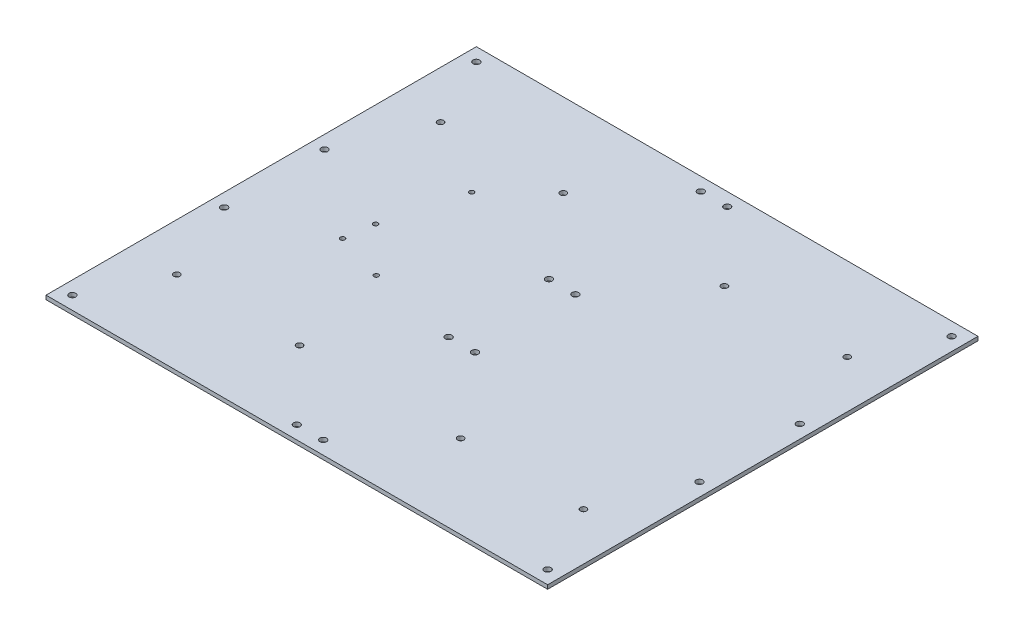
ISO-10303-21;
HEADER;
FILE_DESCRIPTION(('STEP AP214'),'2;1');
FILE_NAME('part.step','',(''),(''),'','','');
FILE_SCHEMA(('AUTOMOTIVE_DESIGN { 1 0 10303 214 1 1 1 1 }'));
ENDSEC;
DATA;
#1=APPLICATION_CONTEXT('core data for automotive mechanical design processes');
#2=APPLICATION_PROTOCOL_DEFINITION('international standard','automotive_design',2000,#1);
#3=PRODUCT_CONTEXT('',#1,'mechanical');
#4=PRODUCT('Part','Part','',(#3));
#5=PRODUCT_RELATED_PRODUCT_CATEGORY('part','',(#4));
#6=PRODUCT_DEFINITION_FORMATION('','',#4);
#7=PRODUCT_DEFINITION_CONTEXT('part definition',#1,'design');
#8=PRODUCT_DEFINITION('design','',#6,#7);
#9=PRODUCT_DEFINITION_SHAPE('','',#8);
#10=(LENGTH_UNIT() NAMED_UNIT(*) SI_UNIT(.MILLI.,.METRE.));
#11=(NAMED_UNIT(*) PLANE_ANGLE_UNIT() SI_UNIT($,.RADIAN.));
#12=(NAMED_UNIT(*) SI_UNIT($,.STERADIAN.) SOLID_ANGLE_UNIT());
#13=UNCERTAINTY_MEASURE_WITH_UNIT(LENGTH_MEASURE(1.E-05),#10,'distance_accuracy_value','');
#14=(GEOMETRIC_REPRESENTATION_CONTEXT(3) GLOBAL_UNCERTAINTY_ASSIGNED_CONTEXT((#13)) GLOBAL_UNIT_ASSIGNED_CONTEXT((#10,
#11,#12)) REPRESENTATION_CONTEXT('',''));
#15=CARTESIAN_POINT('',(0.,0.,0.));
#16=DIRECTION('',(0.,0.,1.));
#17=DIRECTION('',(1.,0.,0.));
#18=AXIS2_PLACEMENT_3D('',#15,#16,#17);
#19=CARTESIAN_POINT('',(-190.,3.,163.));
#20=DIRECTION('',(1.,0.,0.));
#21=DIRECTION('',(0.,0.,-1.));
#22=AXIS2_PLACEMENT_3D('',#19,#20,#21);
#23=PLANE('',#22);
#24=DIRECTION('',(0.,0.,1.));
#25=VECTOR('',#24,1.);
#26=CARTESIAN_POINT('',(-190.,0.,163.));
#27=LINE('',#26,#25);
#28=CARTESIAN_POINT('',(-190.,0.,-163.));
#29=VERTEX_POINT('',#28);
#30=CARTESIAN_POINT('',(-190.,0.,163.));
#31=VERTEX_POINT('',#30);
#32=EDGE_CURVE('E108',#29,#31,#27,.T.);
#33=ORIENTED_EDGE('',*,*,#32,.T.);
#34=DIRECTION('',(0.,-1.,0.));
#35=VECTOR('',#34,1.);
#36=CARTESIAN_POINT('',(-190.,3.,163.));
#37=LINE('',#36,#35);
#38=CARTESIAN_POINT('',(-190.,3.,163.));
#39=VERTEX_POINT('',#38);
#40=EDGE_CURVE('E11',#39,#31,#37,.T.);
#41=ORIENTED_EDGE('',*,*,#40,.F.);
#42=DIRECTION('',(0.,0.,1.));
#43=VECTOR('',#42,1.);
#44=CARTESIAN_POINT('',(-190.,3.,163.));
#45=LINE('',#44,#43);
#46=CARTESIAN_POINT('',(-190.,3.,-163.));
#47=VERTEX_POINT('',#46);
#48=EDGE_CURVE('E96',#47,#39,#45,.T.);
#49=ORIENTED_EDGE('',*,*,#48,.F.);
#50=DIRECTION('',(0.,-1.,0.));
#51=VECTOR('',#50,1.);
#52=CARTESIAN_POINT('',(-190.,3.,-163.));
#53=LINE('',#52,#51);
#54=EDGE_CURVE('E104',#47,#29,#53,.T.);
#55=ORIENTED_EDGE('',*,*,#54,.T.);
#56=EDGE_LOOP('',(#33,#41,#49,#55));
#57=FACE_BOUND('',#56,.T.);
#58=ADVANCED_FACE('F45',(#57),#23,.F.);
#59=CARTESIAN_POINT('',(190.,3.,163.));
#60=DIRECTION('',(0.,0.,-1.));
#61=DIRECTION('',(-1.,0.,0.));
#62=AXIS2_PLACEMENT_3D('',#59,#60,#61);
#63=PLANE('',#62);
#64=DIRECTION('',(1.,0.,0.));
#65=VECTOR('',#64,1.);
#66=CARTESIAN_POINT('',(190.,0.,163.));
#67=LINE('',#66,#65);
#68=CARTESIAN_POINT('',(190.,0.,163.));
#69=VERTEX_POINT('',#68);
#70=EDGE_CURVE('E100',#31,#69,#67,.T.);
#71=ORIENTED_EDGE('',*,*,#70,.T.);
#72=DIRECTION('',(0.,-1.,0.));
#73=VECTOR('',#72,1.);
#74=CARTESIAN_POINT('',(190.,3.,163.));
#75=LINE('',#74,#73);
#76=CARTESIAN_POINT('',(190.,3.,163.));
#77=VERTEX_POINT('',#76);
#78=EDGE_CURVE('E53',#77,#69,#75,.T.);
#79=ORIENTED_EDGE('',*,*,#78,.F.);
#80=DIRECTION('',(1.,0.,0.));
#81=VECTOR('',#80,1.);
#82=CARTESIAN_POINT('',(190.,3.,163.));
#83=LINE('',#82,#81);
#84=EDGE_CURVE('E91',#39,#77,#83,.T.);
#85=ORIENTED_EDGE('',*,*,#84,.F.);
#86=ORIENTED_EDGE('',*,*,#40,.T.);
#87=EDGE_LOOP('',(#71,#79,#85,#86));
#88=FACE_BOUND('',#87,.T.);
#89=ADVANCED_FACE('F99',(#88),#63,.F.);
#90=CARTESIAN_POINT('',(190.,3.,163.));
#91=DIRECTION('',(-1.,0.,0.));
#92=DIRECTION('',(0.,0.,1.));
#93=AXIS2_PLACEMENT_3D('',#90,#91,#92);
#94=PLANE('',#93);
#95=DIRECTION('',(0.,0.,-1.));
#96=VECTOR('',#95,1.);
#97=CARTESIAN_POINT('',(190.,0.,163.));
#98=LINE('',#97,#96);
#99=CARTESIAN_POINT('',(190.,0.,-163.));
#100=VERTEX_POINT('',#99);
#101=EDGE_CURVE('E78',#69,#100,#98,.T.);
#102=ORIENTED_EDGE('',*,*,#101,.T.);
#103=DIRECTION('',(0.,-1.,0.));
#104=VECTOR('',#103,1.);
#105=CARTESIAN_POINT('',(190.,3.,-163.));
#106=LINE('',#105,#104);
#107=CARTESIAN_POINT('',(190.,3.,-163.));
#108=VERTEX_POINT('',#107);
#109=EDGE_CURVE('E101',#108,#100,#106,.T.);
#110=ORIENTED_EDGE('',*,*,#109,.F.);
#111=DIRECTION('',(0.,0.,-1.));
#112=VECTOR('',#111,1.);
#113=CARTESIAN_POINT('',(190.,3.,163.));
#114=LINE('',#113,#112);
#115=EDGE_CURVE('E94',#77,#108,#114,.T.);
#116=ORIENTED_EDGE('',*,*,#115,.F.);
#117=ORIENTED_EDGE('',*,*,#78,.T.);
#118=EDGE_LOOP('',(#102,#110,#116,#117));
#119=FACE_BOUND('',#118,.T.);
#120=ADVANCED_FACE('F102',(#119),#94,.F.);
#121=CARTESIAN_POINT('',(190.,3.,-163.));
#122=DIRECTION('',(0.,0.,1.));
#123=DIRECTION('',(1.,0.,0.));
#124=AXIS2_PLACEMENT_3D('',#121,#122,#123);
#125=PLANE('',#124);
#126=DIRECTION('',(-1.,0.,0.));
#127=VECTOR('',#126,1.);
#128=CARTESIAN_POINT('',(190.,0.,-163.));
#129=LINE('',#128,#127);
#130=EDGE_CURVE('E84',#100,#29,#129,.T.);
#131=ORIENTED_EDGE('',*,*,#130,.T.);
#132=ORIENTED_EDGE('',*,*,#54,.F.);
#133=DIRECTION('',(-1.,0.,0.));
#134=VECTOR('',#133,1.);
#135=CARTESIAN_POINT('',(190.,3.,-163.));
#136=LINE('',#135,#134);
#137=EDGE_CURVE('E61',#108,#47,#136,.T.);
#138=ORIENTED_EDGE('',*,*,#137,.F.);
#139=ORIENTED_EDGE('',*,*,#109,.T.);
#140=EDGE_LOOP('',(#131,#132,#138,#139));
#141=FACE_BOUND('',#140,.T.);
#142=ADVANCED_FACE('F116',(#141),#125,.F.);
#143=CARTESIAN_POINT('',(0.,3.,0.));
#144=DIRECTION('',(0.,1.,0.));
#145=DIRECTION('',(0.,0.,1.));
#146=AXIS2_PLACEMENT_3D('',#143,#144,#145);
#147=PLANE('',#146);
#148=CARTESIAN_POINT('',(-96.3390472553626,3.,-65.75));
#149=DIRECTION('',(0.,1.,0.));
#150=DIRECTION('',(0.,0.,1.));
#151=AXIS2_PLACEMENT_3D('',#148,#149,#150);
#152=CIRCLE('',#151,1.75);
#153=CARTESIAN_POINT('',(-96.3390472553626,3.,-64.));
#154=VERTEX_POINT('',#153);
#155=EDGE_CURVE('E275',#154,#154,#152,.T.);
#156=ORIENTED_EDGE('',*,*,#155,.F.);
#157=EDGE_LOOP('',(#156));
#158=FACE_BOUND('',#157,.T.);
#159=CARTESIAN_POINT('',(-111.839047255363,3.,-8.50000000000004));
#160=DIRECTION('',(0.,1.,0.));
#161=DIRECTION('',(0.,0.,1.));
#162=AXIS2_PLACEMENT_3D('',#159,#160,#161);
#163=CIRCLE('',#162,1.75);
#164=CARTESIAN_POINT('',(-111.839047255363,3.,-6.75000000000004));
#165=VERTEX_POINT('',#164);
#166=EDGE_CURVE('E281',#165,#165,#163,.T.);
#167=ORIENTED_EDGE('',*,*,#166,.F.);
#168=EDGE_LOOP('',(#167));
#169=FACE_BOUND('',#168,.T.);
#170=CARTESIAN_POINT('',(-77.8390472553626,3.,25.));
#171=DIRECTION('',(0.,1.,0.));
#172=DIRECTION('',(0.,0.,1.));
#173=AXIS2_PLACEMENT_3D('',#170,#171,#172);
#174=CIRCLE('',#173,1.75);
#175=CARTESIAN_POINT('',(-77.8390472553626,3.,26.75));
#176=VERTEX_POINT('',#175);
#177=EDGE_CURVE('E269',#176,#176,#174,.T.);
#178=ORIENTED_EDGE('',*,*,#177,.F.);
#179=EDGE_LOOP('',(#178));
#180=FACE_BOUND('',#179,.T.);
#181=CARTESIAN_POINT('',(-114.839047255363,3.,13.5));
#182=DIRECTION('',(0.,1.,0.));
#183=DIRECTION('',(0.,0.,1.));
#184=AXIS2_PLACEMENT_3D('',#181,#182,#183);
#185=CIRCLE('',#184,1.75);
#186=CARTESIAN_POINT('',(-114.839047255363,3.,15.25));
#187=VERTEX_POINT('',#186);
#188=EDGE_CURVE('E266',#187,#187,#185,.T.);
#189=ORIENTED_EDGE('',*,*,#188,.F.);
#190=EDGE_LOOP('',(#189));
#191=FACE_BOUND('',#190,.T.);
#192=CARTESIAN_POINT('',(-61.,3.,-99.9000000000001));
#193=DIRECTION('',(0.,1.,0.));
#194=DIRECTION('',(0.,0.,1.));
#195=AXIS2_PLACEMENT_3D('',#192,#193,#194);
#196=CIRCLE('',#195,2.35);
#197=CARTESIAN_POINT('',(-61.,3.,-97.5500000000001));
#198=VERTEX_POINT('',#197);
#199=EDGE_CURVE('E239',#198,#198,#196,.T.);
#200=ORIENTED_EDGE('',*,*,#199,.F.);
#201=EDGE_LOOP('',(#200));
#202=FACE_BOUND('',#201,.T.);
#203=CARTESIAN_POINT('',(154.,3.,99.9));
#204=DIRECTION('',(0.,1.,0.));
#205=DIRECTION('',(0.,0.,1.));
#206=AXIS2_PLACEMENT_3D('',#203,#204,#205);
#207=CIRCLE('',#206,2.35);
#208=CARTESIAN_POINT('',(154.,3.,102.25));
#209=VERTEX_POINT('',#208);
#210=EDGE_CURVE('E228',#209,#209,#207,.T.);
#211=ORIENTED_EDGE('',*,*,#210,.F.);
#212=EDGE_LOOP('',(#211));
#213=FACE_BOUND('',#212,.T.);
#214=CARTESIAN_POINT('',(61.0000000000001,3.,99.9));
#215=DIRECTION('',(0.,1.,0.));
#216=DIRECTION('',(0.,0.,1.));
#217=AXIS2_PLACEMENT_3D('',#214,#215,#216);
#218=CIRCLE('',#217,2.35);
#219=CARTESIAN_POINT('',(61.0000000000001,3.,102.25));
#220=VERTEX_POINT('',#219);
#221=EDGE_CURVE('E227',#220,#220,#218,.T.);
#222=ORIENTED_EDGE('',*,*,#221,.F.);
#223=EDGE_LOOP('',(#222));
#224=FACE_BOUND('',#223,.T.);
#225=CARTESIAN_POINT('',(-60.9999999999999,3.,99.9));
#226=DIRECTION('',(0.,1.,0.));
#227=DIRECTION('',(0.,0.,1.));
#228=AXIS2_PLACEMENT_3D('',#225,#226,#227);
#229=CIRCLE('',#228,2.35);
#230=CARTESIAN_POINT('',(-60.9999999999999,3.,102.25));
#231=VERTEX_POINT('',#230);
#232=EDGE_CURVE('E221',#231,#231,#229,.T.);
#233=ORIENTED_EDGE('',*,*,#232,.F.);
#234=EDGE_LOOP('',(#233));
#235=FACE_BOUND('',#234,.T.);
#236=CARTESIAN_POINT('',(61.,3.,-99.9000000000001));
#237=DIRECTION('',(0.,1.,0.));
#238=DIRECTION('',(0.,0.,1.));
#239=AXIS2_PLACEMENT_3D('',#236,#237,#238);
#240=CIRCLE('',#239,2.35);
#241=CARTESIAN_POINT('',(61.,3.,-97.5500000000001));
#242=VERTEX_POINT('',#241);
#243=EDGE_CURVE('E240',#242,#242,#240,.T.);
#244=ORIENTED_EDGE('',*,*,#243,.F.);
#245=EDGE_LOOP('',(#244));
#246=FACE_BOUND('',#245,.T.);
#247=CARTESIAN_POINT('',(154.,3.,-99.9000000000001));
#248=DIRECTION('',(0.,1.,0.));
#249=DIRECTION('',(0.,0.,1.));
#250=AXIS2_PLACEMENT_3D('',#247,#248,#249);
#251=CIRCLE('',#250,2.35);
#252=CARTESIAN_POINT('',(154.,3.,-97.5500000000001));
#253=VERTEX_POINT('',#252);
#254=EDGE_CURVE('E258',#253,#253,#251,.T.);
#255=ORIENTED_EDGE('',*,*,#254,.F.);
#256=EDGE_LOOP('',(#255));
#257=FACE_BOUND('',#256,.T.);
#258=CARTESIAN_POINT('',(-154.,3.,-99.9000000000001));
#259=DIRECTION('',(0.,1.,0.));
#260=DIRECTION('',(0.,0.,1.));
#261=AXIS2_PLACEMENT_3D('',#258,#259,#260);
#262=CIRCLE('',#261,2.35);
#263=CARTESIAN_POINT('',(-154.,3.,-97.5500000000001));
#264=VERTEX_POINT('',#263);
#265=EDGE_CURVE('E251',#264,#264,#262,.T.);
#266=ORIENTED_EDGE('',*,*,#265,.F.);
#267=EDGE_LOOP('',(#266));
#268=FACE_BOUND('',#267,.T.);
#269=CARTESIAN_POINT('',(-154.,3.,99.9));
#270=DIRECTION('',(0.,1.,0.));
#271=DIRECTION('',(0.,0.,1.));
#272=AXIS2_PLACEMENT_3D('',#269,#270,#271);
#273=CIRCLE('',#272,2.35);
#274=CARTESIAN_POINT('',(-154.,3.,102.25));
#275=VERTEX_POINT('',#274);
#276=EDGE_CURVE('E218',#275,#275,#273,.T.);
#277=ORIENTED_EDGE('',*,*,#276,.F.);
#278=EDGE_LOOP('',(#277));
#279=FACE_BOUND('',#278,.T.);
#280=CARTESIAN_POINT('',(10.,3.,-153.));
#281=DIRECTION('',(0.,1.,0.));
#282=DIRECTION('',(0.,0.,1.));
#283=AXIS2_PLACEMENT_3D('',#280,#281,#282);
#284=CIRCLE('',#283,2.5);
#285=CARTESIAN_POINT('',(10.,3.,-150.5));
#286=VERTEX_POINT('',#285);
#287=EDGE_CURVE('E144',#286,#286,#284,.T.);
#288=ORIENTED_EDGE('',*,*,#287,.F.);
#289=EDGE_LOOP('',(#288));
#290=FACE_BOUND('',#289,.T.);
#291=CARTESIAN_POINT('',(-9.99999999999993,3.,-38.));
#292=DIRECTION('',(0.,1.,0.));
#293=DIRECTION('',(0.,0.,1.));
#294=AXIS2_PLACEMENT_3D('',#291,#292,#293);
#295=CIRCLE('',#294,2.50000000000001);
#296=CARTESIAN_POINT('',(-9.99999999999993,3.,-35.5));
#297=VERTEX_POINT('',#296);
#298=EDGE_CURVE('E155',#297,#297,#295,.T.);
#299=ORIENTED_EDGE('',*,*,#298,.F.);
#300=EDGE_LOOP('',(#299));
#301=FACE_BOUND('',#300,.T.);
#302=CARTESIAN_POINT('',(10.,3.,-38.));
#303=DIRECTION('',(0.,1.,0.));
#304=DIRECTION('',(0.,0.,1.));
#305=AXIS2_PLACEMENT_3D('',#302,#303,#304);
#306=CIRCLE('',#305,2.5);
#307=CARTESIAN_POINT('',(10.,3.,-35.5));
#308=VERTEX_POINT('',#307);
#309=EDGE_CURVE('E156',#308,#308,#306,.T.);
#310=ORIENTED_EDGE('',*,*,#309,.F.);
#311=EDGE_LOOP('',(#310));
#312=FACE_BOUND('',#311,.T.);
#313=CARTESIAN_POINT('',(-9.99999999999993,3.,38.));
#314=DIRECTION('',(0.,1.,0.));
#315=DIRECTION('',(0.,0.,1.));
#316=AXIS2_PLACEMENT_3D('',#313,#314,#315);
#317=CIRCLE('',#316,2.5);
#318=CARTESIAN_POINT('',(-9.99999999999993,3.,40.5));
#319=VERTEX_POINT('',#318);
#320=EDGE_CURVE('E167',#319,#319,#317,.T.);
#321=ORIENTED_EDGE('',*,*,#320,.F.);
#322=EDGE_LOOP('',(#321));
#323=FACE_BOUND('',#322,.T.);
#324=CARTESIAN_POINT('',(180.,3.,-153.));
#325=DIRECTION('',(0.,1.,0.));
#326=DIRECTION('',(0.,0.,1.));
#327=AXIS2_PLACEMENT_3D('',#324,#325,#326);
#328=CIRCLE('',#327,2.5);
#329=CARTESIAN_POINT('',(180.,3.,-150.5));
#330=VERTEX_POINT('',#329);
#331=EDGE_CURVE('E125',#330,#330,#328,.T.);
#332=ORIENTED_EDGE('',*,*,#331,.F.);
#333=EDGE_LOOP('',(#332));
#334=FACE_BOUND('',#333,.T.);
#335=CARTESIAN_POINT('',(-180.,3.,153.));
#336=DIRECTION('',(0.,1.,0.));
#337=DIRECTION('',(0.,0.,1.));
#338=AXIS2_PLACEMENT_3D('',#335,#336,#337);
#339=CIRCLE('',#338,2.5);
#340=CARTESIAN_POINT('',(-180.,3.,155.5));
#341=VERTEX_POINT('',#340);
#342=EDGE_CURVE('E131',#341,#341,#339,.T.);
#343=ORIENTED_EDGE('',*,*,#342,.F.);
#344=EDGE_LOOP('',(#343));
#345=FACE_BOUND('',#344,.T.);
#346=CARTESIAN_POINT('',(180.,3.,153.));
#347=DIRECTION('',(0.,1.,0.));
#348=DIRECTION('',(0.,0.,1.));
#349=AXIS2_PLACEMENT_3D('',#346,#347,#348);
#350=CIRCLE('',#349,2.5);
#351=CARTESIAN_POINT('',(180.,3.,155.5));
#352=VERTEX_POINT('',#351);
#353=EDGE_CURVE('E132',#352,#352,#350,.T.);
#354=ORIENTED_EDGE('',*,*,#353,.F.);
#355=EDGE_LOOP('',(#354));
#356=FACE_BOUND('',#355,.T.);
#357=CARTESIAN_POINT('',(-9.99999999999995,3.,-153.));
#358=DIRECTION('',(0.,1.,0.));
#359=DIRECTION('',(0.,0.,1.));
#360=AXIS2_PLACEMENT_3D('',#357,#358,#359);
#361=CIRCLE('',#360,2.5);
#362=CARTESIAN_POINT('',(-9.99999999999995,3.,-150.5));
#363=VERTEX_POINT('',#362);
#364=EDGE_CURVE('E143',#363,#363,#361,.T.);
#365=ORIENTED_EDGE('',*,*,#364,.F.);
#366=EDGE_LOOP('',(#365));
#367=FACE_BOUND('',#366,.T.);
#368=CARTESIAN_POINT('',(-180.,3.,38.));
#369=DIRECTION('',(0.,1.,0.));
#370=DIRECTION('',(0.,0.,1.));
#371=AXIS2_PLACEMENT_3D('',#368,#369,#370);
#372=CIRCLE('',#371,2.5);
#373=CARTESIAN_POINT('',(-180.,3.,40.5));
#374=VERTEX_POINT('',#373);
#375=EDGE_CURVE('E192',#374,#374,#372,.T.);
#376=ORIENTED_EDGE('',*,*,#375,.F.);
#377=EDGE_LOOP('',(#376));
#378=FACE_BOUND('',#377,.T.);
#379=CARTESIAN_POINT('',(180.,3.,-38.));
#380=DIRECTION('',(0.,1.,0.));
#381=DIRECTION('',(0.,0.,1.));
#382=AXIS2_PLACEMENT_3D('',#379,#380,#381);
#383=CIRCLE('',#382,2.5);
#384=CARTESIAN_POINT('',(180.,3.,-35.5));
#385=VERTEX_POINT('',#384);
#386=EDGE_CURVE('E203',#385,#385,#383,.T.);
#387=ORIENTED_EDGE('',*,*,#386,.F.);
#388=EDGE_LOOP('',(#387));
#389=FACE_BOUND('',#388,.T.);
#390=CARTESIAN_POINT('',(180.,3.,38.));
#391=DIRECTION('',(0.,1.,0.));
#392=DIRECTION('',(0.,0.,1.));
#393=AXIS2_PLACEMENT_3D('',#390,#391,#392);
#394=CIRCLE('',#393,2.5);
#395=CARTESIAN_POINT('',(180.,3.,40.5));
#396=VERTEX_POINT('',#395);
#397=EDGE_CURVE('E204',#396,#396,#394,.T.);
#398=ORIENTED_EDGE('',*,*,#397,.F.);
#399=EDGE_LOOP('',(#398));
#400=FACE_BOUND('',#399,.T.);
#401=CARTESIAN_POINT('',(10.,3.,38.));
#402=DIRECTION('',(0.,1.,0.));
#403=DIRECTION('',(0.,0.,1.));
#404=AXIS2_PLACEMENT_3D('',#401,#402,#403);
#405=CIRCLE('',#404,2.5);
#406=CARTESIAN_POINT('',(10.,3.,40.5));
#407=VERTEX_POINT('',#406);
#408=EDGE_CURVE('E168',#407,#407,#405,.T.);
#409=ORIENTED_EDGE('',*,*,#408,.F.);
#410=EDGE_LOOP('',(#409));
#411=FACE_BOUND('',#410,.T.);
#412=CARTESIAN_POINT('',(-9.99999999999991,3.,153.));
#413=DIRECTION('',(0.,1.,0.));
#414=DIRECTION('',(0.,0.,1.));
#415=AXIS2_PLACEMENT_3D('',#412,#413,#414);
#416=CIRCLE('',#415,2.5);
#417=CARTESIAN_POINT('',(-9.99999999999991,3.,155.5));
#418=VERTEX_POINT('',#417);
#419=EDGE_CURVE('E179',#418,#418,#416,.T.);
#420=ORIENTED_EDGE('',*,*,#419,.F.);
#421=EDGE_LOOP('',(#420));
#422=FACE_BOUND('',#421,.T.);
#423=CARTESIAN_POINT('',(10.,3.,153.));
#424=DIRECTION('',(0.,1.,0.));
#425=DIRECTION('',(0.,0.,1.));
#426=AXIS2_PLACEMENT_3D('',#423,#424,#425);
#427=CIRCLE('',#426,2.5);
#428=CARTESIAN_POINT('',(10.,3.,155.5));
#429=VERTEX_POINT('',#428);
#430=EDGE_CURVE('E180',#429,#429,#427,.T.);
#431=ORIENTED_EDGE('',*,*,#430,.F.);
#432=EDGE_LOOP('',(#431));
#433=FACE_BOUND('',#432,.T.);
#434=CARTESIAN_POINT('',(-180.,3.,-38.));
#435=DIRECTION('',(0.,1.,0.));
#436=DIRECTION('',(0.,0.,1.));
#437=AXIS2_PLACEMENT_3D('',#434,#435,#436);
#438=CIRCLE('',#437,2.5);
#439=CARTESIAN_POINT('',(-180.,3.,-35.5));
#440=VERTEX_POINT('',#439);
#441=EDGE_CURVE('E191',#440,#440,#438,.T.);
#442=ORIENTED_EDGE('',*,*,#441,.F.);
#443=EDGE_LOOP('',(#442));
#444=FACE_BOUND('',#443,.T.);
#445=CARTESIAN_POINT('',(-180.,3.,-153.));
#446=DIRECTION('',(0.,1.,0.));
#447=DIRECTION('',(0.,0.,1.));
#448=AXIS2_PLACEMENT_3D('',#445,#446,#447);
#449=CIRCLE('',#448,2.5);
#450=CARTESIAN_POINT('',(-180.,3.,-150.5));
#451=VERTEX_POINT('',#450);
#452=EDGE_CURVE('E122',#451,#451,#449,.T.);
#453=ORIENTED_EDGE('',*,*,#452,.F.);
#454=EDGE_LOOP('',(#453));
#455=FACE_BOUND('',#454,.T.);
#456=ORIENTED_EDGE('',*,*,#48,.T.);
#457=ORIENTED_EDGE('',*,*,#84,.T.);
#458=ORIENTED_EDGE('',*,*,#115,.T.);
#459=ORIENTED_EDGE('',*,*,#137,.T.);
#460=EDGE_LOOP('',(#456,#457,#458,#459));
#461=FACE_BOUND('',#460,.T.);
#462=ADVANCED_FACE('F92',(#158,#169,#180,#191,#202,#213,#224,#235,#246,#257,#268,#279,#290,#301,
#312,#323,#334,#345,#356,#367,#378,#389,#400,#411,#422,#433,#444,#455,#461),#147,.T.);
#463=CARTESIAN_POINT('',(0.,0.,0.));
#464=DIRECTION('',(0.,1.,0.));
#465=DIRECTION('',(0.,0.,1.));
#466=AXIS2_PLACEMENT_3D('',#463,#464,#465);
#467=PLANE('',#466);
#468=CARTESIAN_POINT('',(-96.3390472553626,0.,-65.75));
#469=DIRECTION('',(0.,1.,0.));
#470=DIRECTION('',(0.,0.,1.));
#471=AXIS2_PLACEMENT_3D('',#468,#469,#470);
#472=CIRCLE('',#471,1.75);
#473=CARTESIAN_POINT('',(-96.3390472553626,0.,-64.));
#474=VERTEX_POINT('',#473);
#475=EDGE_CURVE('E272',#474,#474,#472,.T.);
#476=ORIENTED_EDGE('',*,*,#475,.T.);
#477=EDGE_LOOP('',(#476));
#478=FACE_BOUND('',#477,.T.);
#479=CARTESIAN_POINT('',(-111.839047255363,0.,-8.50000000000004));
#480=DIRECTION('',(0.,1.,0.));
#481=DIRECTION('',(0.,0.,1.));
#482=AXIS2_PLACEMENT_3D('',#479,#480,#481);
#483=CIRCLE('',#482,1.75);
#484=CARTESIAN_POINT('',(-111.839047255363,0.,-6.75000000000004));
#485=VERTEX_POINT('',#484);
#486=EDGE_CURVE('E278',#485,#485,#483,.T.);
#487=ORIENTED_EDGE('',*,*,#486,.T.);
#488=EDGE_LOOP('',(#487));
#489=FACE_BOUND('',#488,.T.);
#490=CARTESIAN_POINT('',(-77.8390472553626,0.,25.));
#491=DIRECTION('',(0.,1.,0.));
#492=DIRECTION('',(0.,0.,1.));
#493=AXIS2_PLACEMENT_3D('',#490,#491,#492);
#494=CIRCLE('',#493,1.75);
#495=CARTESIAN_POINT('',(-77.8390472553626,0.,26.75));
#496=VERTEX_POINT('',#495);
#497=EDGE_CURVE('E284',#496,#496,#494,.T.);
#498=ORIENTED_EDGE('',*,*,#497,.T.);
#499=EDGE_LOOP('',(#498));
#500=FACE_BOUND('',#499,.T.);
#501=CARTESIAN_POINT('',(-114.839047255363,0.,13.5));
#502=DIRECTION('',(0.,1.,0.));
#503=DIRECTION('',(0.,0.,1.));
#504=AXIS2_PLACEMENT_3D('',#501,#502,#503);
#505=CIRCLE('',#504,1.75);
#506=CARTESIAN_POINT('',(-114.839047255363,0.,15.25));
#507=VERTEX_POINT('',#506);
#508=EDGE_CURVE('E252',#507,#507,#505,.T.);
#509=ORIENTED_EDGE('',*,*,#508,.T.);
#510=EDGE_LOOP('',(#509));
#511=FACE_BOUND('',#510,.T.);
#512=CARTESIAN_POINT('',(-61.,0.,-99.9000000000001));
#513=DIRECTION('',(0.,1.,0.));
#514=DIRECTION('',(0.,0.,1.));
#515=AXIS2_PLACEMENT_3D('',#512,#513,#514);
#516=CIRCLE('',#515,2.35);
#517=CARTESIAN_POINT('',(-61.,0.,-97.5500000000001));
#518=VERTEX_POINT('',#517);
#519=EDGE_CURVE('E236',#518,#518,#516,.T.);
#520=ORIENTED_EDGE('',*,*,#519,.T.);
#521=EDGE_LOOP('',(#520));
#522=FACE_BOUND('',#521,.T.);
#523=CARTESIAN_POINT('',(154.,0.,99.9));
#524=DIRECTION('',(0.,1.,0.));
#525=DIRECTION('',(0.,0.,1.));
#526=AXIS2_PLACEMENT_3D('',#523,#524,#525);
#527=CIRCLE('',#526,2.35);
#528=CARTESIAN_POINT('',(154.,0.,102.25));
#529=VERTEX_POINT('',#528);
#530=EDGE_CURVE('E243',#529,#529,#527,.T.);
#531=ORIENTED_EDGE('',*,*,#530,.T.);
#532=EDGE_LOOP('',(#531));
#533=FACE_BOUND('',#532,.T.);
#534=CARTESIAN_POINT('',(61.0000000000001,0.,99.9));
#535=DIRECTION('',(0.,1.,0.));
#536=DIRECTION('',(0.,0.,1.));
#537=AXIS2_PLACEMENT_3D('',#534,#535,#536);
#538=CIRCLE('',#537,2.35);
#539=CARTESIAN_POINT('',(61.0000000000001,0.,102.25));
#540=VERTEX_POINT('',#539);
#541=EDGE_CURVE('E224',#540,#540,#538,.T.);
#542=ORIENTED_EDGE('',*,*,#541,.T.);
#543=EDGE_LOOP('',(#542));
#544=FACE_BOUND('',#543,.T.);
#545=CARTESIAN_POINT('',(-60.9999999999999,0.,99.9));
#546=DIRECTION('',(0.,1.,0.));
#547=DIRECTION('',(0.,0.,1.));
#548=AXIS2_PLACEMENT_3D('',#545,#546,#547);
#549=CIRCLE('',#548,2.35);
#550=CARTESIAN_POINT('',(-60.9999999999999,0.,102.25));
#551=VERTEX_POINT('',#550);
#552=EDGE_CURVE('E231',#551,#551,#549,.T.);
#553=ORIENTED_EDGE('',*,*,#552,.T.);
#554=EDGE_LOOP('',(#553));
#555=FACE_BOUND('',#554,.T.);
#556=CARTESIAN_POINT('',(61.,0.,-99.9000000000001));
#557=DIRECTION('',(0.,1.,0.));
#558=DIRECTION('',(0.,0.,1.));
#559=AXIS2_PLACEMENT_3D('',#556,#557,#558);
#560=CIRCLE('',#559,2.35);
#561=CARTESIAN_POINT('',(61.,0.,-97.5500000000001));
#562=VERTEX_POINT('',#561);
#563=EDGE_CURVE('E261',#562,#562,#560,.T.);
#564=ORIENTED_EDGE('',*,*,#563,.T.);
#565=EDGE_LOOP('',(#564));
#566=FACE_BOUND('',#565,.T.);
#567=CARTESIAN_POINT('',(154.,0.,-99.9000000000001));
#568=DIRECTION('',(0.,1.,0.));
#569=DIRECTION('',(0.,0.,1.));
#570=AXIS2_PLACEMENT_3D('',#567,#568,#569);
#571=CIRCLE('',#570,2.35);
#572=CARTESIAN_POINT('',(154.,0.,-97.5500000000001));
#573=VERTEX_POINT('',#572);
#574=EDGE_CURVE('E255',#573,#573,#571,.T.);
#575=ORIENTED_EDGE('',*,*,#574,.T.);
#576=EDGE_LOOP('',(#575));
#577=FACE_BOUND('',#576,.T.);
#578=CARTESIAN_POINT('',(-154.,0.,-99.9000000000001));
#579=DIRECTION('',(0.,1.,0.));
#580=DIRECTION('',(0.,0.,1.));
#581=AXIS2_PLACEMENT_3D('',#578,#579,#580);
#582=CIRCLE('',#581,2.35);
#583=CARTESIAN_POINT('',(-154.,0.,-97.5500000000001));
#584=VERTEX_POINT('',#583);
#585=EDGE_CURVE('E248',#584,#584,#582,.T.);
#586=ORIENTED_EDGE('',*,*,#585,.T.);
#587=EDGE_LOOP('',(#586));
#588=FACE_BOUND('',#587,.T.);
#589=CARTESIAN_POINT('',(-154.,0.,99.9));
#590=DIRECTION('',(0.,1.,0.));
#591=DIRECTION('',(0.,0.,1.));
#592=AXIS2_PLACEMENT_3D('',#589,#590,#591);
#593=CIRCLE('',#592,2.35);
#594=CARTESIAN_POINT('',(-154.,0.,102.25));
#595=VERTEX_POINT('',#594);
#596=EDGE_CURVE('E215',#595,#595,#593,.T.);
#597=ORIENTED_EDGE('',*,*,#596,.T.);
#598=EDGE_LOOP('',(#597));
#599=FACE_BOUND('',#598,.T.);
#600=CARTESIAN_POINT('',(10.,0.,-153.));
#601=DIRECTION('',(0.,1.,0.));
#602=DIRECTION('',(0.,0.,1.));
#603=AXIS2_PLACEMENT_3D('',#600,#601,#602);
#604=CIRCLE('',#603,2.5);
#605=CARTESIAN_POINT('',(10.,0.,-150.5));
#606=VERTEX_POINT('',#605);
#607=EDGE_CURVE('E159',#606,#606,#604,.T.);
#608=ORIENTED_EDGE('',*,*,#607,.T.);
#609=EDGE_LOOP('',(#608));
#610=FACE_BOUND('',#609,.T.);
#611=CARTESIAN_POINT('',(-9.99999999999993,0.,-38.));
#612=DIRECTION('',(0.,1.,0.));
#613=DIRECTION('',(0.,0.,1.));
#614=AXIS2_PLACEMENT_3D('',#611,#612,#613);
#615=CIRCLE('',#614,2.50000000000001);
#616=CARTESIAN_POINT('',(-9.99999999999993,0.,-35.5));
#617=VERTEX_POINT('',#616);
#618=EDGE_CURVE('E152',#617,#617,#615,.T.);
#619=ORIENTED_EDGE('',*,*,#618,.T.);
#620=EDGE_LOOP('',(#619));
#621=FACE_BOUND('',#620,.T.);
#622=CARTESIAN_POINT('',(10.,0.,-38.));
#623=DIRECTION('',(0.,1.,0.));
#624=DIRECTION('',(0.,0.,1.));
#625=AXIS2_PLACEMENT_3D('',#622,#623,#624);
#626=CIRCLE('',#625,2.5);
#627=CARTESIAN_POINT('',(10.,0.,-35.5));
#628=VERTEX_POINT('',#627);
#629=EDGE_CURVE('E171',#628,#628,#626,.T.);
#630=ORIENTED_EDGE('',*,*,#629,.T.);
#631=EDGE_LOOP('',(#630));
#632=FACE_BOUND('',#631,.T.);
#633=CARTESIAN_POINT('',(-9.99999999999993,0.,38.));
#634=DIRECTION('',(0.,1.,0.));
#635=DIRECTION('',(0.,0.,1.));
#636=AXIS2_PLACEMENT_3D('',#633,#634,#635);
#637=CIRCLE('',#636,2.5);
#638=CARTESIAN_POINT('',(-9.99999999999993,0.,40.5));
#639=VERTEX_POINT('',#638);
#640=EDGE_CURVE('E164',#639,#639,#637,.T.);
#641=ORIENTED_EDGE('',*,*,#640,.T.);
#642=EDGE_LOOP('',(#641));
#643=FACE_BOUND('',#642,.T.);
#644=CARTESIAN_POINT('',(180.,0.,-153.));
#645=DIRECTION('',(0.,1.,0.));
#646=DIRECTION('',(0.,0.,1.));
#647=AXIS2_PLACEMENT_3D('',#644,#645,#646);
#648=CIRCLE('',#647,2.5);
#649=CARTESIAN_POINT('',(180.,0.,-150.5));
#650=VERTEX_POINT('',#649);
#651=EDGE_CURVE('E135',#650,#650,#648,.T.);
#652=ORIENTED_EDGE('',*,*,#651,.T.);
#653=EDGE_LOOP('',(#652));
#654=FACE_BOUND('',#653,.T.);
#655=CARTESIAN_POINT('',(-180.,0.,153.));
#656=DIRECTION('',(0.,1.,0.));
#657=DIRECTION('',(0.,0.,1.));
#658=AXIS2_PLACEMENT_3D('',#655,#656,#657);
#659=CIRCLE('',#658,2.5);
#660=CARTESIAN_POINT('',(-180.,0.,155.5));
#661=VERTEX_POINT('',#660);
#662=EDGE_CURVE('E128',#661,#661,#659,.T.);
#663=ORIENTED_EDGE('',*,*,#662,.T.);
#664=EDGE_LOOP('',(#663));
#665=FACE_BOUND('',#664,.T.);
#666=CARTESIAN_POINT('',(180.,0.,153.));
#667=DIRECTION('',(0.,1.,0.));
#668=DIRECTION('',(0.,0.,1.));
#669=AXIS2_PLACEMENT_3D('',#666,#667,#668);
#670=CIRCLE('',#669,2.5);
#671=CARTESIAN_POINT('',(180.,0.,155.5));
#672=VERTEX_POINT('',#671);
#673=EDGE_CURVE('E147',#672,#672,#670,.T.);
#674=ORIENTED_EDGE('',*,*,#673,.T.);
#675=EDGE_LOOP('',(#674));
#676=FACE_BOUND('',#675,.T.);
#677=CARTESIAN_POINT('',(-9.99999999999995,0.,-153.));
#678=DIRECTION('',(0.,1.,0.));
#679=DIRECTION('',(0.,0.,1.));
#680=AXIS2_PLACEMENT_3D('',#677,#678,#679);
#681=CIRCLE('',#680,2.5);
#682=CARTESIAN_POINT('',(-9.99999999999995,0.,-150.5));
#683=VERTEX_POINT('',#682);
#684=EDGE_CURVE('E140',#683,#683,#681,.T.);
#685=ORIENTED_EDGE('',*,*,#684,.T.);
#686=EDGE_LOOP('',(#685));
#687=FACE_BOUND('',#686,.T.);
#688=CARTESIAN_POINT('',(-180.,0.,38.));
#689=DIRECTION('',(0.,1.,0.));
#690=DIRECTION('',(0.,0.,1.));
#691=AXIS2_PLACEMENT_3D('',#688,#689,#690);
#692=CIRCLE('',#691,2.5);
#693=CARTESIAN_POINT('',(-180.,0.,40.5));
#694=VERTEX_POINT('',#693);
#695=EDGE_CURVE('E207',#694,#694,#692,.T.);
#696=ORIENTED_EDGE('',*,*,#695,.T.);
#697=EDGE_LOOP('',(#696));
#698=FACE_BOUND('',#697,.T.);
#699=CARTESIAN_POINT('',(180.,0.,-38.));
#700=DIRECTION('',(0.,1.,0.));
#701=DIRECTION('',(0.,0.,1.));
#702=AXIS2_PLACEMENT_3D('',#699,#700,#701);
#703=CIRCLE('',#702,2.5);
#704=CARTESIAN_POINT('',(180.,0.,-35.5));
#705=VERTEX_POINT('',#704);
#706=EDGE_CURVE('E200',#705,#705,#703,.T.);
#707=ORIENTED_EDGE('',*,*,#706,.T.);
#708=EDGE_LOOP('',(#707));
#709=FACE_BOUND('',#708,.T.);
#710=CARTESIAN_POINT('',(180.,0.,38.));
#711=DIRECTION('',(0.,1.,0.));
#712=DIRECTION('',(0.,0.,1.));
#713=AXIS2_PLACEMENT_3D('',#710,#711,#712);
#714=CIRCLE('',#713,2.5);
#715=CARTESIAN_POINT('',(180.,0.,40.5));
#716=VERTEX_POINT('',#715);
#717=EDGE_CURVE('E212',#716,#716,#714,.T.);
#718=ORIENTED_EDGE('',*,*,#717,.T.);
#719=EDGE_LOOP('',(#718));
#720=FACE_BOUND('',#719,.T.);
#721=CARTESIAN_POINT('',(10.,0.,38.));
#722=DIRECTION('',(0.,1.,0.));
#723=DIRECTION('',(0.,0.,1.));
#724=AXIS2_PLACEMENT_3D('',#721,#722,#723);
#725=CIRCLE('',#724,2.5);
#726=CARTESIAN_POINT('',(10.,0.,40.5));
#727=VERTEX_POINT('',#726);
#728=EDGE_CURVE('E183',#727,#727,#725,.T.);
#729=ORIENTED_EDGE('',*,*,#728,.T.);
#730=EDGE_LOOP('',(#729));
#731=FACE_BOUND('',#730,.T.);
#732=CARTESIAN_POINT('',(-9.99999999999991,0.,153.));
#733=DIRECTION('',(0.,1.,0.));
#734=DIRECTION('',(0.,0.,1.));
#735=AXIS2_PLACEMENT_3D('',#732,#733,#734);
#736=CIRCLE('',#735,2.5);
#737=CARTESIAN_POINT('',(-9.99999999999991,0.,155.5));
#738=VERTEX_POINT('',#737);
#739=EDGE_CURVE('E176',#738,#738,#736,.T.);
#740=ORIENTED_EDGE('',*,*,#739,.T.);
#741=EDGE_LOOP('',(#740));
#742=FACE_BOUND('',#741,.T.);
#743=CARTESIAN_POINT('',(10.,0.,153.));
#744=DIRECTION('',(0.,1.,0.));
#745=DIRECTION('',(0.,0.,1.));
#746=AXIS2_PLACEMENT_3D('',#743,#744,#745);
#747=CIRCLE('',#746,2.5);
#748=CARTESIAN_POINT('',(10.,0.,155.5));
#749=VERTEX_POINT('',#748);
#750=EDGE_CURVE('E195',#749,#749,#747,.T.);
#751=ORIENTED_EDGE('',*,*,#750,.T.);
#752=EDGE_LOOP('',(#751));
#753=FACE_BOUND('',#752,.T.);
#754=CARTESIAN_POINT('',(-180.,0.,-38.));
#755=DIRECTION('',(0.,1.,0.));
#756=DIRECTION('',(0.,0.,1.));
#757=AXIS2_PLACEMENT_3D('',#754,#755,#756);
#758=CIRCLE('',#757,2.5);
#759=CARTESIAN_POINT('',(-180.,0.,-35.5));
#760=VERTEX_POINT('',#759);
#761=EDGE_CURVE('E188',#760,#760,#758,.T.);
#762=ORIENTED_EDGE('',*,*,#761,.T.);
#763=EDGE_LOOP('',(#762));
#764=FACE_BOUND('',#763,.T.);
#765=CARTESIAN_POINT('',(-180.,0.,-153.));
#766=DIRECTION('',(0.,1.,0.));
#767=DIRECTION('',(0.,0.,1.));
#768=AXIS2_PLACEMENT_3D('',#765,#766,#767);
#769=CIRCLE('',#768,2.5);
#770=CARTESIAN_POINT('',(-180.,0.,-150.5));
#771=VERTEX_POINT('',#770);
#772=EDGE_CURVE('E111',#771,#771,#769,.T.);
#773=ORIENTED_EDGE('',*,*,#772,.T.);
#774=EDGE_LOOP('',(#773));
#775=FACE_BOUND('',#774,.T.);
#776=ORIENTED_EDGE('',*,*,#32,.F.);
#777=ORIENTED_EDGE('',*,*,#130,.F.);
#778=ORIENTED_EDGE('',*,*,#101,.F.);
#779=ORIENTED_EDGE('',*,*,#70,.F.);
#780=EDGE_LOOP('',(#776,#777,#778,#779));
#781=FACE_BOUND('',#780,.T.);
#782=ADVANCED_FACE('F119',(#478,#489,#500,#511,#522,#533,#544,#555,#566,#577,#588,#599,#610,
#621,#632,#643,#654,#665,#676,#687,#698,#709,#720,#731,#742,#753,#764,#775,#781),#467,.F.);
#783=CARTESIAN_POINT('',(-180.,0.,-153.));
#784=DIRECTION('',(0.,1.,0.));
#785=DIRECTION('',(0.,0.,1.));
#786=AXIS2_PLACEMENT_3D('',#783,#784,#785);
#787=CYLINDRICAL_SURFACE('',#786,2.5);
#788=ORIENTED_EDGE('',*,*,#772,.F.);
#789=EDGE_LOOP('',(#788));
#790=FACE_BOUND('',#789,.T.);
#791=ORIENTED_EDGE('',*,*,#452,.T.);
#792=EDGE_LOOP('',(#791));
#793=FACE_BOUND('',#792,.T.);
#794=ADVANCED_FACE('F346',(#790,#793),#787,.F.);
#795=CARTESIAN_POINT('',(-180.,0.,-38.));
#796=DIRECTION('',(0.,1.,0.));
#797=DIRECTION('',(0.,0.,1.));
#798=AXIS2_PLACEMENT_3D('',#795,#796,#797);
#799=CYLINDRICAL_SURFACE('',#798,2.5);
#800=ORIENTED_EDGE('',*,*,#761,.F.);
#801=EDGE_LOOP('',(#800));
#802=FACE_BOUND('',#801,.T.);
#803=ORIENTED_EDGE('',*,*,#441,.T.);
#804=EDGE_LOOP('',(#803));
#805=FACE_BOUND('',#804,.T.);
#806=ADVANCED_FACE('F348',(#802,#805),#799,.F.);
#807=CARTESIAN_POINT('',(10.,0.,153.));
#808=DIRECTION('',(0.,1.,0.));
#809=DIRECTION('',(0.,0.,1.));
#810=AXIS2_PLACEMENT_3D('',#807,#808,#809);
#811=CYLINDRICAL_SURFACE('',#810,2.5);
#812=ORIENTED_EDGE('',*,*,#750,.F.);
#813=EDGE_LOOP('',(#812));
#814=FACE_BOUND('',#813,.T.);
#815=ORIENTED_EDGE('',*,*,#430,.T.);
#816=EDGE_LOOP('',(#815));
#817=FACE_BOUND('',#816,.T.);
#818=ADVANCED_FACE('F355',(#814,#817),#811,.F.);
#819=CARTESIAN_POINT('',(-9.99999999999991,0.,153.));
#820=DIRECTION('',(0.,1.,0.));
#821=DIRECTION('',(0.,0.,1.));
#822=AXIS2_PLACEMENT_3D('',#819,#820,#821);
#823=CYLINDRICAL_SURFACE('',#822,2.5);
#824=ORIENTED_EDGE('',*,*,#739,.F.);
#825=EDGE_LOOP('',(#824));
#826=FACE_BOUND('',#825,.T.);
#827=ORIENTED_EDGE('',*,*,#419,.T.);
#828=EDGE_LOOP('',(#827));
#829=FACE_BOUND('',#828,.T.);
#830=ADVANCED_FACE('F645',(#826,#829),#823,.F.);
#831=CARTESIAN_POINT('',(10.,0.,38.));
#832=DIRECTION('',(0.,1.,0.));
#833=DIRECTION('',(0.,0.,1.));
#834=AXIS2_PLACEMENT_3D('',#831,#832,#833);
#835=CYLINDRICAL_SURFACE('',#834,2.5);
#836=ORIENTED_EDGE('',*,*,#728,.F.);
#837=EDGE_LOOP('',(#836));
#838=FACE_BOUND('',#837,.T.);
#839=ORIENTED_EDGE('',*,*,#408,.T.);
#840=EDGE_LOOP('',(#839));
#841=FACE_BOUND('',#840,.T.);
#842=ADVANCED_FACE('F636',(#838,#841),#835,.F.);
#843=CARTESIAN_POINT('',(180.,0.,38.));
#844=DIRECTION('',(0.,1.,0.));
#845=DIRECTION('',(0.,0.,1.));
#846=AXIS2_PLACEMENT_3D('',#843,#844,#845);
#847=CYLINDRICAL_SURFACE('',#846,2.5);
#848=ORIENTED_EDGE('',*,*,#717,.F.);
#849=EDGE_LOOP('',(#848));
#850=FACE_BOUND('',#849,.T.);
#851=ORIENTED_EDGE('',*,*,#397,.T.);
#852=EDGE_LOOP('',(#851));
#853=FACE_BOUND('',#852,.T.);
#854=ADVANCED_FACE('F627',(#850,#853),#847,.F.);
#855=CARTESIAN_POINT('',(180.,0.,-38.));
#856=DIRECTION('',(0.,1.,0.));
#857=DIRECTION('',(0.,0.,1.));
#858=AXIS2_PLACEMENT_3D('',#855,#856,#857);
#859=CYLINDRICAL_SURFACE('',#858,2.5);
#860=ORIENTED_EDGE('',*,*,#706,.F.);
#861=EDGE_LOOP('',(#860));
#862=FACE_BOUND('',#861,.T.);
#863=ORIENTED_EDGE('',*,*,#386,.T.);
#864=EDGE_LOOP('',(#863));
#865=FACE_BOUND('',#864,.T.);
#866=ADVANCED_FACE('F618',(#862,#865),#859,.F.);
#867=CARTESIAN_POINT('',(-180.,0.,38.));
#868=DIRECTION('',(0.,1.,0.));
#869=DIRECTION('',(0.,0.,1.));
#870=AXIS2_PLACEMENT_3D('',#867,#868,#869);
#871=CYLINDRICAL_SURFACE('',#870,2.5);
#872=ORIENTED_EDGE('',*,*,#695,.F.);
#873=EDGE_LOOP('',(#872));
#874=FACE_BOUND('',#873,.T.);
#875=ORIENTED_EDGE('',*,*,#375,.T.);
#876=EDGE_LOOP('',(#875));
#877=FACE_BOUND('',#876,.T.);
#878=ADVANCED_FACE('F609',(#874,#877),#871,.F.);
#879=CARTESIAN_POINT('',(-9.99999999999995,0.,-153.));
#880=DIRECTION('',(0.,1.,0.));
#881=DIRECTION('',(0.,0.,1.));
#882=AXIS2_PLACEMENT_3D('',#879,#880,#881);
#883=CYLINDRICAL_SURFACE('',#882,2.5);
#884=ORIENTED_EDGE('',*,*,#684,.F.);
#885=EDGE_LOOP('',(#884));
#886=FACE_BOUND('',#885,.T.);
#887=ORIENTED_EDGE('',*,*,#364,.T.);
#888=EDGE_LOOP('',(#887));
#889=FACE_BOUND('',#888,.T.);
#890=ADVANCED_FACE('F600',(#886,#889),#883,.F.);
#891=CARTESIAN_POINT('',(180.,0.,153.));
#892=DIRECTION('',(0.,1.,0.));
#893=DIRECTION('',(0.,0.,1.));
#894=AXIS2_PLACEMENT_3D('',#891,#892,#893);
#895=CYLINDRICAL_SURFACE('',#894,2.5);
#896=ORIENTED_EDGE('',*,*,#673,.F.);
#897=EDGE_LOOP('',(#896));
#898=FACE_BOUND('',#897,.T.);
#899=ORIENTED_EDGE('',*,*,#353,.T.);
#900=EDGE_LOOP('',(#899));
#901=FACE_BOUND('',#900,.T.);
#902=ADVANCED_FACE('F592',(#898,#901),#895,.F.);
#903=CARTESIAN_POINT('',(-180.,0.,153.));
#904=DIRECTION('',(0.,1.,0.));
#905=DIRECTION('',(0.,0.,1.));
#906=AXIS2_PLACEMENT_3D('',#903,#904,#905);
#907=CYLINDRICAL_SURFACE('',#906,2.5);
#908=ORIENTED_EDGE('',*,*,#662,.F.);
#909=EDGE_LOOP('',(#908));
#910=FACE_BOUND('',#909,.T.);
#911=ORIENTED_EDGE('',*,*,#342,.T.);
#912=EDGE_LOOP('',(#911));
#913=FACE_BOUND('',#912,.T.);
#914=ADVANCED_FACE('F583',(#910,#913),#907,.F.);
#915=CARTESIAN_POINT('',(180.,0.,-153.));
#916=DIRECTION('',(0.,1.,0.));
#917=DIRECTION('',(0.,0.,1.));
#918=AXIS2_PLACEMENT_3D('',#915,#916,#917);
#919=CYLINDRICAL_SURFACE('',#918,2.5);
#920=ORIENTED_EDGE('',*,*,#651,.F.);
#921=EDGE_LOOP('',(#920));
#922=FACE_BOUND('',#921,.T.);
#923=ORIENTED_EDGE('',*,*,#331,.T.);
#924=EDGE_LOOP('',(#923));
#925=FACE_BOUND('',#924,.T.);
#926=ADVANCED_FACE('F574',(#922,#925),#919,.F.);
#927=CARTESIAN_POINT('',(-9.99999999999993,0.,38.));
#928=DIRECTION('',(0.,1.,0.));
#929=DIRECTION('',(0.,0.,1.));
#930=AXIS2_PLACEMENT_3D('',#927,#928,#929);
#931=CYLINDRICAL_SURFACE('',#930,2.5);
#932=ORIENTED_EDGE('',*,*,#640,.F.);
#933=EDGE_LOOP('',(#932));
#934=FACE_BOUND('',#933,.T.);
#935=ORIENTED_EDGE('',*,*,#320,.T.);
#936=EDGE_LOOP('',(#935));
#937=FACE_BOUND('',#936,.T.);
#938=ADVANCED_FACE('F565',(#934,#937),#931,.F.);
#939=CARTESIAN_POINT('',(10.,0.,-38.));
#940=DIRECTION('',(0.,1.,0.));
#941=DIRECTION('',(0.,0.,1.));
#942=AXIS2_PLACEMENT_3D('',#939,#940,#941);
#943=CYLINDRICAL_SURFACE('',#942,2.5);
#944=ORIENTED_EDGE('',*,*,#629,.F.);
#945=EDGE_LOOP('',(#944));
#946=FACE_BOUND('',#945,.T.);
#947=ORIENTED_EDGE('',*,*,#309,.T.);
#948=EDGE_LOOP('',(#947));
#949=FACE_BOUND('',#948,.T.);
#950=ADVANCED_FACE('F556',(#946,#949),#943,.F.);
#951=CARTESIAN_POINT('',(-9.99999999999993,0.,-38.));
#952=DIRECTION('',(0.,1.,0.));
#953=DIRECTION('',(0.,0.,1.));
#954=AXIS2_PLACEMENT_3D('',#951,#952,#953);
#955=CYLINDRICAL_SURFACE('',#954,2.50000000000001);
#956=ORIENTED_EDGE('',*,*,#618,.F.);
#957=EDGE_LOOP('',(#956));
#958=FACE_BOUND('',#957,.T.);
#959=ORIENTED_EDGE('',*,*,#298,.T.);
#960=EDGE_LOOP('',(#959));
#961=FACE_BOUND('',#960,.T.);
#962=ADVANCED_FACE('F547',(#958,#961),#955,.F.);
#963=CARTESIAN_POINT('',(10.,0.,-153.));
#964=DIRECTION('',(0.,1.,0.));
#965=DIRECTION('',(0.,0.,1.));
#966=AXIS2_PLACEMENT_3D('',#963,#964,#965);
#967=CYLINDRICAL_SURFACE('',#966,2.5);
#968=ORIENTED_EDGE('',*,*,#607,.F.);
#969=EDGE_LOOP('',(#968));
#970=FACE_BOUND('',#969,.T.);
#971=ORIENTED_EDGE('',*,*,#287,.T.);
#972=EDGE_LOOP('',(#971));
#973=FACE_BOUND('',#972,.T.);
#974=ADVANCED_FACE('F538',(#970,#973),#967,.F.);
#975=CARTESIAN_POINT('',(-154.,0.,99.9));
#976=DIRECTION('',(0.,1.,0.));
#977=DIRECTION('',(0.,0.,1.));
#978=AXIS2_PLACEMENT_3D('',#975,#976,#977);
#979=CYLINDRICAL_SURFACE('',#978,2.35);
#980=ORIENTED_EDGE('',*,*,#596,.F.);
#981=EDGE_LOOP('',(#980));
#982=FACE_BOUND('',#981,.T.);
#983=ORIENTED_EDGE('',*,*,#276,.T.);
#984=EDGE_LOOP('',(#983));
#985=FACE_BOUND('',#984,.T.);
#986=ADVANCED_FACE('F529',(#982,#985),#979,.F.);
#987=CARTESIAN_POINT('',(-154.,0.,-99.9000000000001));
#988=DIRECTION('',(0.,1.,0.));
#989=DIRECTION('',(0.,0.,1.));
#990=AXIS2_PLACEMENT_3D('',#987,#988,#989);
#991=CYLINDRICAL_SURFACE('',#990,2.35);
#992=ORIENTED_EDGE('',*,*,#585,.F.);
#993=EDGE_LOOP('',(#992));
#994=FACE_BOUND('',#993,.T.);
#995=ORIENTED_EDGE('',*,*,#265,.T.);
#996=EDGE_LOOP('',(#995));
#997=FACE_BOUND('',#996,.T.);
#998=ADVANCED_FACE('F520',(#994,#997),#991,.F.);
#999=CARTESIAN_POINT('',(154.,0.,-99.9000000000001));
#1000=DIRECTION('',(0.,1.,0.));
#1001=DIRECTION('',(0.,0.,1.));
#1002=AXIS2_PLACEMENT_3D('',#999,#1000,#1001);
#1003=CYLINDRICAL_SURFACE('',#1002,2.35);
#1004=ORIENTED_EDGE('',*,*,#574,.F.);
#1005=EDGE_LOOP('',(#1004));
#1006=FACE_BOUND('',#1005,.T.);
#1007=ORIENTED_EDGE('',*,*,#254,.T.);
#1008=EDGE_LOOP('',(#1007));
#1009=FACE_BOUND('',#1008,.T.);
#1010=ADVANCED_FACE('F511',(#1006,#1009),#1003,.F.);
#1011=CARTESIAN_POINT('',(61.,0.,-99.9000000000001));
#1012=DIRECTION('',(0.,1.,0.));
#1013=DIRECTION('',(0.,0.,1.));
#1014=AXIS2_PLACEMENT_3D('',#1011,#1012,#1013);
#1015=CYLINDRICAL_SURFACE('',#1014,2.35);
#1016=ORIENTED_EDGE('',*,*,#563,.F.);
#1017=EDGE_LOOP('',(#1016));
#1018=FACE_BOUND('',#1017,.T.);
#1019=ORIENTED_EDGE('',*,*,#243,.T.);
#1020=EDGE_LOOP('',(#1019));
#1021=FACE_BOUND('',#1020,.T.);
#1022=ADVANCED_FACE('F502',(#1018,#1021),#1015,.F.);
#1023=CARTESIAN_POINT('',(-60.9999999999999,0.,99.9));
#1024=DIRECTION('',(0.,1.,0.));
#1025=DIRECTION('',(0.,0.,1.));
#1026=AXIS2_PLACEMENT_3D('',#1023,#1024,#1025);
#1027=CYLINDRICAL_SURFACE('',#1026,2.35);
#1028=ORIENTED_EDGE('',*,*,#552,.F.);
#1029=EDGE_LOOP('',(#1028));
#1030=FACE_BOUND('',#1029,.T.);
#1031=ORIENTED_EDGE('',*,*,#232,.T.);
#1032=EDGE_LOOP('',(#1031));
#1033=FACE_BOUND('',#1032,.T.);
#1034=ADVANCED_FACE('F493',(#1030,#1033),#1027,.F.);
#1035=CARTESIAN_POINT('',(61.0000000000001,0.,99.9));
#1036=DIRECTION('',(0.,1.,0.));
#1037=DIRECTION('',(0.,0.,1.));
#1038=AXIS2_PLACEMENT_3D('',#1035,#1036,#1037);
#1039=CYLINDRICAL_SURFACE('',#1038,2.35);
#1040=ORIENTED_EDGE('',*,*,#541,.F.);
#1041=EDGE_LOOP('',(#1040));
#1042=FACE_BOUND('',#1041,.T.);
#1043=ORIENTED_EDGE('',*,*,#221,.T.);
#1044=EDGE_LOOP('',(#1043));
#1045=FACE_BOUND('',#1044,.T.);
#1046=ADVANCED_FACE('F484',(#1042,#1045),#1039,.F.);
#1047=CARTESIAN_POINT('',(154.,0.,99.9));
#1048=DIRECTION('',(0.,1.,0.));
#1049=DIRECTION('',(0.,0.,1.));
#1050=AXIS2_PLACEMENT_3D('',#1047,#1048,#1049);
#1051=CYLINDRICAL_SURFACE('',#1050,2.35);
#1052=ORIENTED_EDGE('',*,*,#530,.F.);
#1053=EDGE_LOOP('',(#1052));
#1054=FACE_BOUND('',#1053,.T.);
#1055=ORIENTED_EDGE('',*,*,#210,.T.);
#1056=EDGE_LOOP('',(#1055));
#1057=FACE_BOUND('',#1056,.T.);
#1058=ADVANCED_FACE('F476',(#1054,#1057),#1051,.F.);
#1059=CARTESIAN_POINT('',(-61.,0.,-99.9000000000001));
#1060=DIRECTION('',(0.,1.,0.));
#1061=DIRECTION('',(0.,0.,1.));
#1062=AXIS2_PLACEMENT_3D('',#1059,#1060,#1061);
#1063=CYLINDRICAL_SURFACE('',#1062,2.35);
#1064=ORIENTED_EDGE('',*,*,#519,.F.);
#1065=EDGE_LOOP('',(#1064));
#1066=FACE_BOUND('',#1065,.T.);
#1067=ORIENTED_EDGE('',*,*,#199,.T.);
#1068=EDGE_LOOP('',(#1067));
#1069=FACE_BOUND('',#1068,.T.);
#1070=ADVANCED_FACE('F426',(#1066,#1069),#1063,.F.);
#1071=CARTESIAN_POINT('',(-114.839047255363,0.,13.5));
#1072=DIRECTION('',(0.,1.,0.));
#1073=DIRECTION('',(0.,0.,1.));
#1074=AXIS2_PLACEMENT_3D('',#1071,#1072,#1073);
#1075=CYLINDRICAL_SURFACE('',#1074,1.75);
#1076=ORIENTED_EDGE('',*,*,#508,.F.);
#1077=EDGE_LOOP('',(#1076));
#1078=FACE_BOUND('',#1077,.T.);
#1079=ORIENTED_EDGE('',*,*,#188,.T.);
#1080=EDGE_LOOP('',(#1079));
#1081=FACE_BOUND('',#1080,.T.);
#1082=ADVANCED_FACE('F435',(#1078,#1081),#1075,.F.);
#1083=CARTESIAN_POINT('',(-77.8390472553626,0.,25.));
#1084=DIRECTION('',(0.,1.,0.));
#1085=DIRECTION('',(0.,0.,1.));
#1086=AXIS2_PLACEMENT_3D('',#1083,#1084,#1085);
#1087=CYLINDRICAL_SURFACE('',#1086,1.75);
#1088=ORIENTED_EDGE('',*,*,#497,.F.);
#1089=EDGE_LOOP('',(#1088));
#1090=FACE_BOUND('',#1089,.T.);
#1091=ORIENTED_EDGE('',*,*,#177,.T.);
#1092=EDGE_LOOP('',(#1091));
#1093=FACE_BOUND('',#1092,.T.);
#1094=ADVANCED_FACE('F290',(#1090,#1093),#1087,.F.);
#1095=CARTESIAN_POINT('',(-111.839047255363,0.,-8.50000000000004));
#1096=DIRECTION('',(0.,1.,0.));
#1097=DIRECTION('',(0.,0.,1.));
#1098=AXIS2_PLACEMENT_3D('',#1095,#1096,#1097);
#1099=CYLINDRICAL_SURFACE('',#1098,1.75);
#1100=ORIENTED_EDGE('',*,*,#486,.F.);
#1101=EDGE_LOOP('',(#1100));
#1102=FACE_BOUND('',#1101,.T.);
#1103=ORIENTED_EDGE('',*,*,#166,.T.);
#1104=EDGE_LOOP('',(#1103));
#1105=FACE_BOUND('',#1104,.T.);
#1106=ADVANCED_FACE('F447',(#1102,#1105),#1099,.F.);
#1107=CARTESIAN_POINT('',(-96.3390472553626,0.,-65.75));
#1108=DIRECTION('',(0.,1.,0.));
#1109=DIRECTION('',(0.,0.,1.));
#1110=AXIS2_PLACEMENT_3D('',#1107,#1108,#1109);
#1111=CYLINDRICAL_SURFACE('',#1110,1.75);
#1112=ORIENTED_EDGE('',*,*,#475,.F.);
#1113=EDGE_LOOP('',(#1112));
#1114=FACE_BOUND('',#1113,.T.);
#1115=ORIENTED_EDGE('',*,*,#155,.T.);
#1116=EDGE_LOOP('',(#1115));
#1117=FACE_BOUND('',#1116,.T.);
#1118=ADVANCED_FACE('F456',(#1114,#1117),#1111,.F.);
#1119=CLOSED_SHELL('',(#58,#89,#120,#142,#462,#782,#794,#806,#818,#830,#842,#854,#866,#878,#890,
#902,#914,#926,#938,#950,#962,#974,#986,#998,#1010,#1022,#1034,#1046,#1058,#1070,#1082,#1094,
#1106,#1118));
#1120=MANIFOLD_SOLID_BREP('B2',#1119);
#1121=ADVANCED_BREP_SHAPE_REPRESENTATION('',(#18,#1120),#14);
#1122=SHAPE_DEFINITION_REPRESENTATION(#9,#1121);
ENDSEC;
END-ISO-10303-21;
